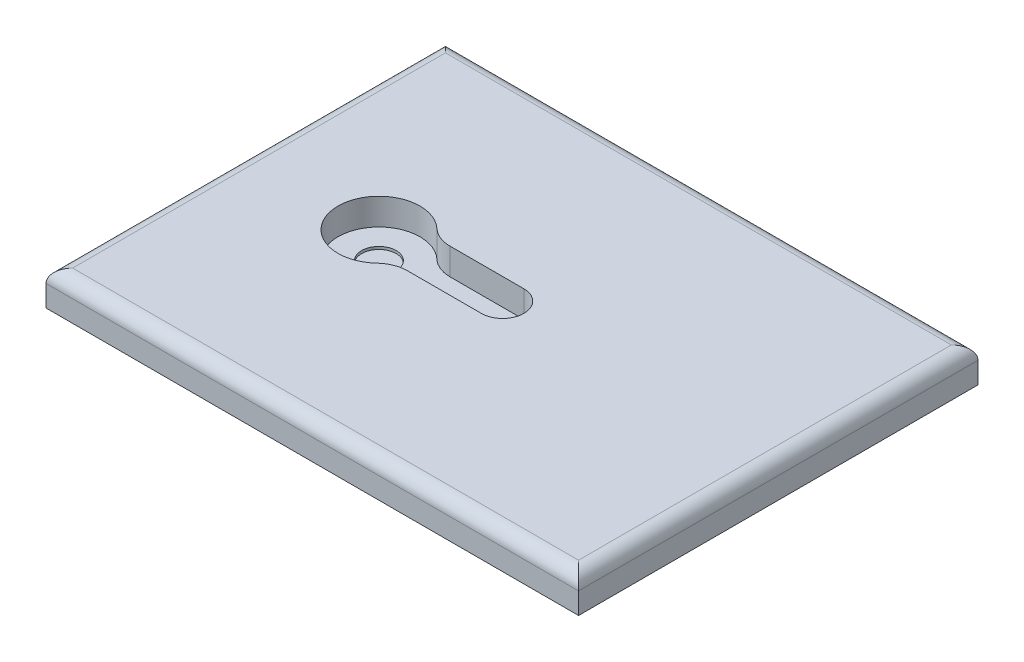
ISO-10303-21;
HEADER;
FILE_DESCRIPTION(('STEP AP214'),'2;1');
FILE_NAME('part.step','',(''),(''),'','','');
FILE_SCHEMA(('AUTOMOTIVE_DESIGN { 1 0 10303 214 1 1 1 1 }'));
ENDSEC;
DATA;
#1=APPLICATION_CONTEXT('core data for automotive mechanical design processes');
#2=APPLICATION_PROTOCOL_DEFINITION('international standard','automotive_design',2000,#1);
#3=PRODUCT_CONTEXT('',#1,'mechanical');
#4=PRODUCT('Part','Part','',(#3));
#5=PRODUCT_RELATED_PRODUCT_CATEGORY('part','',(#4));
#6=PRODUCT_DEFINITION_FORMATION('','',#4);
#7=PRODUCT_DEFINITION_CONTEXT('part definition',#1,'design');
#8=PRODUCT_DEFINITION('design','',#6,#7);
#9=PRODUCT_DEFINITION_SHAPE('','',#8);
#10=(LENGTH_UNIT() NAMED_UNIT(*) SI_UNIT(.MILLI.,.METRE.));
#11=(NAMED_UNIT(*) PLANE_ANGLE_UNIT() SI_UNIT($,.RADIAN.));
#12=(NAMED_UNIT(*) SI_UNIT($,.STERADIAN.) SOLID_ANGLE_UNIT());
#13=UNCERTAINTY_MEASURE_WITH_UNIT(LENGTH_MEASURE(1.E-05),#10,'distance_accuracy_value','');
#14=(GEOMETRIC_REPRESENTATION_CONTEXT(3) GLOBAL_UNCERTAINTY_ASSIGNED_CONTEXT((#13)) GLOBAL_UNIT_ASSIGNED_CONTEXT((#10,
#11,#12)) REPRESENTATION_CONTEXT('',''));
#15=CARTESIAN_POINT('',(0.,0.,0.));
#16=DIRECTION('',(0.,0.,1.));
#17=DIRECTION('',(1.,0.,0.));
#18=AXIS2_PLACEMENT_3D('',#15,#16,#17);
#19=CARTESIAN_POINT('',(-35.0274223034735,6.5,51.0146252285192));
#20=DIRECTION('',(1.,0.,0.));
#21=DIRECTION('',(0.,0.,-1.));
#22=AXIS2_PLACEMENT_3D('',#19,#20,#21);
#23=PLANE('',#22);
#24=DIRECTION('',(0.,-1.,0.));
#25=VECTOR('',#24,1.);
#26=CARTESIAN_POINT('',(-35.0274223034735,6.5,51.0146252285192));
#27=LINE('',#26,#25);
#28=CARTESIAN_POINT('',(-35.0274223034735,4.,51.0146252285192));
#29=VERTEX_POINT('',#28);
#30=CARTESIAN_POINT('',(-35.0274223034735,0.,51.0146252285192));
#31=VERTEX_POINT('',#30);
#32=EDGE_CURVE('E189',#29,#31,#27,.T.);
#33=ORIENTED_EDGE('',*,*,#32,.F.);
#34=DIRECTION('',(0.,0.,1.));
#35=VECTOR('',#34,1.);
#36=CARTESIAN_POINT('',(-35.0274223034735,4.,51.0146252285192));
#37=LINE('',#36,#35);
#38=CARTESIAN_POINT('',(-35.0274223034735,4.,-23.9853747714808));
#39=VERTEX_POINT('',#38);
#40=EDGE_CURVE('E200',#29,#39,#37,.F.);
#41=ORIENTED_EDGE('',*,*,#40,.T.);
#42=DIRECTION('',(0.,-1.,0.));
#43=VECTOR('',#42,1.);
#44=CARTESIAN_POINT('',(-35.0274223034735,6.5,-23.9853747714808));
#45=LINE('',#44,#43);
#46=CARTESIAN_POINT('',(-35.0274223034735,0.,-23.9853747714808));
#47=VERTEX_POINT('',#46);
#48=EDGE_CURVE('E183',#39,#47,#45,.T.);
#49=ORIENTED_EDGE('',*,*,#48,.T.);
#50=DIRECTION('',(0.,0.,1.));
#51=VECTOR('',#50,1.);
#52=CARTESIAN_POINT('',(-35.0274223034735,0.,51.0146252285192));
#53=LINE('',#52,#51);
#54=EDGE_CURVE('E170',#47,#31,#53,.T.);
#55=ORIENTED_EDGE('',*,*,#54,.T.);
#56=EDGE_LOOP('',(#33,#41,#49,#55));
#57=FACE_BOUND('',#56,.T.);
#58=ADVANCED_FACE('F41',(#57),#23,.F.);
#59=CARTESIAN_POINT('',(64.9725776965265,6.5,51.0146252285192));
#60=DIRECTION('',(0.,0.,-1.));
#61=DIRECTION('',(-1.,0.,0.));
#62=AXIS2_PLACEMENT_3D('',#59,#60,#61);
#63=PLANE('',#62);
#64=DIRECTION('',(0.,-1.,0.));
#65=VECTOR('',#64,1.);
#66=CARTESIAN_POINT('',(64.9725776965265,6.5,51.0146252285192));
#67=LINE('',#66,#65);
#68=CARTESIAN_POINT('',(64.9725776965265,4.,51.0146252285192));
#69=VERTEX_POINT('',#68);
#70=CARTESIAN_POINT('',(64.9725776965265,0.,51.0146252285192));
#71=VERTEX_POINT('',#70);
#72=EDGE_CURVE('E187',#69,#71,#67,.T.);
#73=ORIENTED_EDGE('',*,*,#72,.F.);
#74=DIRECTION('',(1.,0.,0.));
#75=VECTOR('',#74,1.);
#76=CARTESIAN_POINT('',(64.9725776965265,4.,51.0146252285192));
#77=LINE('',#76,#75);
#78=EDGE_CURVE('E207',#69,#29,#77,.F.);
#79=ORIENTED_EDGE('',*,*,#78,.T.);
#80=ORIENTED_EDGE('',*,*,#32,.T.);
#81=DIRECTION('',(1.,0.,0.));
#82=VECTOR('',#81,1.);
#83=CARTESIAN_POINT('',(64.9725776965265,0.,51.0146252285192));
#84=LINE('',#83,#82);
#85=EDGE_CURVE('E173',#31,#71,#84,.T.);
#86=ORIENTED_EDGE('',*,*,#85,.T.);
#87=EDGE_LOOP('',(#73,#79,#80,#86));
#88=FACE_BOUND('',#87,.T.);
#89=ADVANCED_FACE('F249',(#88),#63,.F.);
#90=CARTESIAN_POINT('',(64.9725776965265,6.5,-23.9853747714808));
#91=DIRECTION('',(-1.,0.,0.));
#92=DIRECTION('',(0.,0.,1.));
#93=AXIS2_PLACEMENT_3D('',#90,#91,#92);
#94=PLANE('',#93);
#95=DIRECTION('',(0.,-1.,0.));
#96=VECTOR('',#95,1.);
#97=CARTESIAN_POINT('',(64.9725776965265,6.5,-23.9853747714808));
#98=LINE('',#97,#96);
#99=CARTESIAN_POINT('',(64.9725776965265,4.,-23.9853747714808));
#100=VERTEX_POINT('',#99);
#101=CARTESIAN_POINT('',(64.9725776965265,0.,-23.9853747714808));
#102=VERTEX_POINT('',#101);
#103=EDGE_CURVE('E185',#100,#102,#98,.T.);
#104=ORIENTED_EDGE('',*,*,#103,.F.);
#105=DIRECTION('',(0.,0.,-1.));
#106=VECTOR('',#105,1.);
#107=CARTESIAN_POINT('',(64.9725776965265,4.,-23.9853747714808));
#108=LINE('',#107,#106);
#109=EDGE_CURVE('E205',#100,#69,#108,.F.);
#110=ORIENTED_EDGE('',*,*,#109,.T.);
#111=ORIENTED_EDGE('',*,*,#72,.T.);
#112=DIRECTION('',(0.,0.,-1.));
#113=VECTOR('',#112,1.);
#114=CARTESIAN_POINT('',(64.9725776965265,0.,-23.9853747714808));
#115=LINE('',#114,#113);
#116=EDGE_CURVE('E177',#71,#102,#115,.T.);
#117=ORIENTED_EDGE('',*,*,#116,.T.);
#118=EDGE_LOOP('',(#104,#110,#111,#117));
#119=FACE_BOUND('',#118,.T.);
#120=ADVANCED_FACE('F256',(#119),#94,.F.);
#121=CARTESIAN_POINT('',(-35.0274223034735,6.5,-23.9853747714808));
#122=DIRECTION('',(0.,0.,1.));
#123=DIRECTION('',(1.,0.,0.));
#124=AXIS2_PLACEMENT_3D('',#121,#122,#123);
#125=PLANE('',#124);
#126=ORIENTED_EDGE('',*,*,#48,.F.);
#127=DIRECTION('',(-1.,0.,0.));
#128=VECTOR('',#127,1.);
#129=CARTESIAN_POINT('',(-35.0274223034735,4.,-23.9853747714808));
#130=LINE('',#129,#128);
#131=EDGE_CURVE('E203',#39,#100,#130,.F.);
#132=ORIENTED_EDGE('',*,*,#131,.T.);
#133=ORIENTED_EDGE('',*,*,#103,.T.);
#134=DIRECTION('',(-1.,0.,0.));
#135=VECTOR('',#134,1.);
#136=CARTESIAN_POINT('',(-35.0274223034735,0.,-23.9853747714808));
#137=LINE('',#136,#135);
#138=EDGE_CURVE('E180',#102,#47,#137,.T.);
#139=ORIENTED_EDGE('',*,*,#138,.T.);
#140=EDGE_LOOP('',(#126,#132,#133,#139));
#141=FACE_BOUND('',#140,.T.);
#142=ADVANCED_FACE('F300',(#141),#125,.F.);
#143=CARTESIAN_POINT('',(0.,6.5,0.));
#144=DIRECTION('',(0.,-1.,0.));
#145=DIRECTION('',(0.,0.,-1.));
#146=AXIS2_PLACEMENT_3D('',#143,#144,#145);
#147=PLANE('',#146);
#148=DIRECTION('',(1.,0.,0.));
#149=VECTOR('',#148,1.);
#150=CARTESIAN_POINT('',(-3.42616702003037,6.5,17.5146252285192));
#151=LINE('',#150,#149);
#152=CARTESIAN_POINT('',(-0.641386792981187,6.5,17.5146252285192));
#153=VERTEX_POINT('',#152);
#154=CARTESIAN_POINT('',(13.2130715419053,6.5,17.5146252285192));
#155=VERTEX_POINT('',#154);
#156=EDGE_CURVE('E148',#153,#155,#151,.T.);
#157=ORIENTED_EDGE('',*,*,#156,.F.);
#158=CARTESIAN_POINT('',(-0.641386792981187,6.5,23.5146252285192));
#159=DIRECTION('',(0.,-1.,0.));
#160=DIRECTION('',(0.,0.,-1.));
#161=AXIS2_PLACEMENT_3D('',#158,#159,#160);
#162=CIRCLE('',#161,6.);
#163=CARTESIAN_POINT('',(-4.74253740037721,6.5,19.1350631847236));
#164=VERTEX_POINT('',#163);
#165=EDGE_CURVE('E221',#153,#164,#162,.F.);
#166=ORIENTED_EDGE('',*,*,#165,.T.);
#167=CARTESIAN_POINT('',(-10.0056806798688,6.5,13.5146252285192));
#168=DIRECTION('',(0.,1.,0.));
#169=DIRECTION('',(0.,0.,1.));
#170=AXIS2_PLACEMENT_3D('',#167,#168,#169);
#171=CIRCLE('',#170,7.7);
#172=CARTESIAN_POINT('',(-4.74253740037721,6.5,7.8941872723148));
#173=VERTEX_POINT('',#172);
#174=EDGE_CURVE('E160',#173,#164,#171,.T.);
#175=ORIENTED_EDGE('',*,*,#174,.F.);
#176=CARTESIAN_POINT('',(-0.641386792981188,6.5,3.51462522851917));
#177=DIRECTION('',(0.,-1.,0.));
#178=DIRECTION('',(0.,0.,-1.));
#179=AXIS2_PLACEMENT_3D('',#176,#177,#178);
#180=CIRCLE('',#179,6.);
#181=CARTESIAN_POINT('',(-0.641386792981188,6.5,9.51462522851917));
#182=VERTEX_POINT('',#181);
#183=EDGE_CURVE('E219',#173,#182,#180,.F.);
#184=ORIENTED_EDGE('',*,*,#183,.T.);
#185=DIRECTION('',(-1.,0.,0.));
#186=VECTOR('',#185,1.);
#187=CARTESIAN_POINT('',(-3.42616702003037,6.5,9.51462522851917));
#188=LINE('',#187,#186);
#189=CARTESIAN_POINT('',(13.2130715419053,6.5,9.51462522851917));
#190=VERTEX_POINT('',#189);
#191=EDGE_CURVE('E166',#190,#182,#188,.T.);
#192=ORIENTED_EDGE('',*,*,#191,.F.);
#193=CARTESIAN_POINT('',(13.2130715419053,6.5,13.5146252285192));
#194=DIRECTION('',(0.,1.,0.));
#195=DIRECTION('',(0.,0.,-1.));
#196=AXIS2_PLACEMENT_3D('',#193,#194,#195);
#197=CIRCLE('',#196,4.);
#198=EDGE_CURVE('E164',#155,#190,#197,.T.);
#199=ORIENTED_EDGE('',*,*,#198,.F.);
#200=EDGE_LOOP('',(#157,#166,#175,#184,#192,#199));
#201=FACE_BOUND('',#200,.T.);
#202=DIRECTION('',(-1.,0.,0.));
#203=VECTOR('',#202,1.);
#204=CARTESIAN_POINT('',(0.,6.5,-21.4853747714808));
#205=LINE('',#204,#203);
#206=CARTESIAN_POINT('',(62.4725776965265,6.5,-21.4853747714808));
#207=VERTEX_POINT('',#206);
#208=CARTESIAN_POINT('',(-32.5274223034735,6.5,-21.4853747714808));
#209=VERTEX_POINT('',#208);
#210=EDGE_CURVE('E195',#207,#209,#205,.T.);
#211=ORIENTED_EDGE('',*,*,#210,.T.);
#212=DIRECTION('',(0.,0.,1.));
#213=VECTOR('',#212,1.);
#214=CARTESIAN_POINT('',(-32.5274223034735,6.5,0.));
#215=LINE('',#214,#213);
#216=CARTESIAN_POINT('',(-32.5274223034735,6.5,48.5146252285192));
#217=VERTEX_POINT('',#216);
#218=EDGE_CURVE('E197',#209,#217,#215,.T.);
#219=ORIENTED_EDGE('',*,*,#218,.T.);
#220=DIRECTION('',(1.,0.,0.));
#221=VECTOR('',#220,1.);
#222=CARTESIAN_POINT('',(0.,6.5,48.5146252285192));
#223=LINE('',#222,#221);
#224=CARTESIAN_POINT('',(62.4725776965265,6.5,48.5146252285192));
#225=VERTEX_POINT('',#224);
#226=EDGE_CURVE('E191',#217,#225,#223,.T.);
#227=ORIENTED_EDGE('',*,*,#226,.T.);
#228=DIRECTION('',(0.,0.,-1.));
#229=VECTOR('',#228,1.);
#230=CARTESIAN_POINT('',(62.4725776965265,6.5,0.));
#231=LINE('',#230,#229);
#232=EDGE_CURVE('E193',#225,#207,#231,.T.);
#233=ORIENTED_EDGE('',*,*,#232,.T.);
#234=EDGE_LOOP('',(#211,#219,#227,#233));
#235=FACE_BOUND('',#234,.T.);
#236=ADVANCED_FACE('F233',(#201,#235),#147,.F.);
#237=CARTESIAN_POINT('',(0.,0.,0.));
#238=DIRECTION('',(0.,-1.,0.));
#239=DIRECTION('',(0.,0.,-1.));
#240=AXIS2_PLACEMENT_3D('',#237,#238,#239);
#241=PLANE('',#240);
#242=ORIENTED_EDGE('',*,*,#54,.F.);
#243=ORIENTED_EDGE('',*,*,#138,.F.);
#244=ORIENTED_EDGE('',*,*,#116,.F.);
#245=ORIENTED_EDGE('',*,*,#85,.F.);
#246=EDGE_LOOP('',(#242,#243,#244,#245));
#247=FACE_BOUND('',#246,.T.);
#248=ADVANCED_FACE('F275',(#247),#241,.T.);
#249=CARTESIAN_POINT('',(62.4725776965265,4.,0.));
#250=DIRECTION('',(0.,0.,-1.));
#251=DIRECTION('',(-1.,0.,0.));
#252=AXIS2_PLACEMENT_3D('',#249,#250,#251);
#253=CYLINDRICAL_SURFACE('',#252,2.5);
#254=CARTESIAN_POINT('',(62.4725776965265,4.,48.5146252285192));
#255=DIRECTION('',(0.707106781186547,0.,-0.707106781186548));
#256=DIRECTION('',(0.707106781186548,0.,0.707106781186547));
#257=AXIS2_PLACEMENT_3D('',#254,#255,#256);
#258=ELLIPSE('',#257,3.53553390593274,2.5);
#259=EDGE_CURVE('E213',#69,#225,#258,.F.);
#260=ORIENTED_EDGE('',*,*,#259,.F.);
#261=ORIENTED_EDGE('',*,*,#109,.F.);
#262=CARTESIAN_POINT('',(62.4725776965265,4.,-21.4853747714808));
#263=DIRECTION('',(-0.707106781186548,0.,-0.707106781186547));
#264=DIRECTION('',(0.707106781186547,0.,-0.707106781186548));
#265=AXIS2_PLACEMENT_3D('',#262,#263,#264);
#266=ELLIPSE('',#265,3.53553390593274,2.5);
#267=EDGE_CURVE('E174',#207,#100,#266,.T.);
#268=ORIENTED_EDGE('',*,*,#267,.F.);
#269=ORIENTED_EDGE('',*,*,#232,.F.);
#270=EDGE_LOOP('',(#260,#261,#268,#269));
#271=FACE_BOUND('',#270,.T.);
#272=ADVANCED_FACE('F272',(#271),#253,.T.);
#273=CARTESIAN_POINT('',(0.,4.,-21.4853747714808));
#274=DIRECTION('',(-1.,0.,0.));
#275=DIRECTION('',(0.,0.,1.));
#276=AXIS2_PLACEMENT_3D('',#273,#274,#275);
#277=CYLINDRICAL_SURFACE('',#276,2.5);
#278=ORIENTED_EDGE('',*,*,#267,.T.);
#279=ORIENTED_EDGE('',*,*,#131,.F.);
#280=CARTESIAN_POINT('',(-32.5274223034735,4.,-21.4853747714808));
#281=DIRECTION('',(-0.707106781186547,0.,0.707106781186547));
#282=DIRECTION('',(-0.707106781186547,0.,-0.707106781186547));
#283=AXIS2_PLACEMENT_3D('',#280,#281,#282);
#284=ELLIPSE('',#283,3.53553390593274,2.5);
#285=EDGE_CURVE('E211',#209,#39,#284,.T.);
#286=ORIENTED_EDGE('',*,*,#285,.F.);
#287=ORIENTED_EDGE('',*,*,#210,.F.);
#288=EDGE_LOOP('',(#278,#279,#286,#287));
#289=FACE_BOUND('',#288,.T.);
#290=ADVANCED_FACE('F269',(#289),#277,.T.);
#291=CARTESIAN_POINT('',(0.,4.,48.5146252285192));
#292=DIRECTION('',(1.,0.,0.));
#293=DIRECTION('',(0.,0.,-1.));
#294=AXIS2_PLACEMENT_3D('',#291,#292,#293);
#295=CYLINDRICAL_SURFACE('',#294,2.5);
#296=ORIENTED_EDGE('',*,*,#259,.T.);
#297=ORIENTED_EDGE('',*,*,#226,.F.);
#298=CARTESIAN_POINT('',(-32.5274223034735,4.,48.5146252285192));
#299=DIRECTION('',(0.707106781186548,0.,0.707106781186547));
#300=DIRECTION('',(0.707106781186547,0.,-0.707106781186547));
#301=AXIS2_PLACEMENT_3D('',#298,#299,#300);
#302=ELLIPSE('',#301,3.53553390593274,2.5);
#303=EDGE_CURVE('E168',#29,#217,#302,.F.);
#304=ORIENTED_EDGE('',*,*,#303,.F.);
#305=ORIENTED_EDGE('',*,*,#78,.F.);
#306=EDGE_LOOP('',(#296,#297,#304,#305));
#307=FACE_BOUND('',#306,.T.);
#308=ADVANCED_FACE('F265',(#307),#295,.T.);
#309=CARTESIAN_POINT('',(-32.5274223034735,4.,0.));
#310=DIRECTION('',(0.,0.,1.));
#311=DIRECTION('',(1.,0.,0.));
#312=AXIS2_PLACEMENT_3D('',#309,#310,#311);
#313=CYLINDRICAL_SURFACE('',#312,2.5);
#314=ORIENTED_EDGE('',*,*,#285,.T.);
#315=ORIENTED_EDGE('',*,*,#40,.F.);
#316=ORIENTED_EDGE('',*,*,#303,.T.);
#317=ORIENTED_EDGE('',*,*,#218,.F.);
#318=EDGE_LOOP('',(#314,#315,#316,#317));
#319=FACE_BOUND('',#318,.T.);
#320=ADVANCED_FACE('F262',(#319),#313,.T.);
#321=CARTESIAN_POINT('',(-10.0056806798688,1.5,13.5146252285192));
#322=DIRECTION('',(0.,1.,0.));
#323=DIRECTION('',(0.,0.,1.));
#324=AXIS2_PLACEMENT_3D('',#321,#322,#323);
#325=CYLINDRICAL_SURFACE('',#324,7.7);
#326=ORIENTED_EDGE('',*,*,#174,.T.);
#327=DIRECTION('',(0.,1.,0.));
#328=VECTOR('',#327,1.);
#329=CARTESIAN_POINT('',(-4.74253740037721,1.5,19.1350631847236));
#330=LINE('',#329,#328);
#331=CARTESIAN_POINT('',(-4.74253740037721,1.5,19.1350631847236));
#332=VERTEX_POINT('',#331);
#333=EDGE_CURVE('E64',#164,#332,#330,.F.);
#334=ORIENTED_EDGE('',*,*,#333,.T.);
#335=CARTESIAN_POINT('',(-10.0056806798688,1.5,13.5146252285192));
#336=DIRECTION('',(0.,1.,0.));
#337=DIRECTION('',(0.,0.,1.));
#338=AXIS2_PLACEMENT_3D('',#335,#336,#337);
#339=CIRCLE('',#338,7.7);
#340=CARTESIAN_POINT('',(-4.74253740037721,1.5,7.8941872723148));
#341=VERTEX_POINT('',#340);
#342=EDGE_CURVE('E142',#341,#332,#339,.T.);
#343=ORIENTED_EDGE('',*,*,#342,.F.);
#344=DIRECTION('',(0.,1.,0.));
#345=VECTOR('',#344,1.);
#346=CARTESIAN_POINT('',(-4.74253740037721,1.5,7.8941872723148));
#347=LINE('',#346,#345);
#348=EDGE_CURVE('E223',#341,#173,#347,.T.);
#349=ORIENTED_EDGE('',*,*,#348,.T.);
#350=EDGE_LOOP('',(#326,#334,#343,#349));
#351=FACE_BOUND('',#350,.T.);
#352=ADVANCED_FACE('F229',(#351),#325,.F.);
#353=CARTESIAN_POINT('',(-3.42616702003037,1.5,9.51462522851917));
#354=DIRECTION('',(0.,0.,-1.));
#355=DIRECTION('',(-1.,0.,0.));
#356=AXIS2_PLACEMENT_3D('',#353,#354,#355);
#357=PLANE('',#356);
#358=ORIENTED_EDGE('',*,*,#191,.T.);
#359=DIRECTION('',(0.,1.,0.));
#360=VECTOR('',#359,1.);
#361=CARTESIAN_POINT('',(-0.641386792981188,1.5,9.51462522851917));
#362=LINE('',#361,#360);
#363=CARTESIAN_POINT('',(-0.641386792981188,1.5,9.51462522851917));
#364=VERTEX_POINT('',#363);
#365=EDGE_CURVE('E56',#182,#364,#362,.F.);
#366=ORIENTED_EDGE('',*,*,#365,.T.);
#367=DIRECTION('',(-1.,0.,0.));
#368=VECTOR('',#367,1.);
#369=CARTESIAN_POINT('',(-3.42616702003037,1.5,9.51462522851917));
#370=LINE('',#369,#368);
#371=CARTESIAN_POINT('',(13.2130715419053,1.5,9.51462522851917));
#372=VERTEX_POINT('',#371);
#373=EDGE_CURVE('E153',#372,#364,#370,.T.);
#374=ORIENTED_EDGE('',*,*,#373,.F.);
#375=DIRECTION('',(0.,1.,0.));
#376=VECTOR('',#375,1.);
#377=CARTESIAN_POINT('',(13.2130715419053,1.5,9.51462522851917));
#378=LINE('',#377,#376);
#379=EDGE_CURVE('E152',#372,#190,#378,.T.);
#380=ORIENTED_EDGE('',*,*,#379,.T.);
#381=EDGE_LOOP('',(#358,#366,#374,#380));
#382=FACE_BOUND('',#381,.T.);
#383=ADVANCED_FACE('F313',(#382),#357,.F.);
#384=CARTESIAN_POINT('',(13.2130715419053,1.5,13.5146252285192));
#385=DIRECTION('',(0.,1.,0.));
#386=DIRECTION('',(0.,0.,1.));
#387=AXIS2_PLACEMENT_3D('',#384,#385,#386);
#388=CYLINDRICAL_SURFACE('',#387,4.);
#389=ORIENTED_EDGE('',*,*,#198,.T.);
#390=ORIENTED_EDGE('',*,*,#379,.F.);
#391=CARTESIAN_POINT('',(13.2130715419053,1.5,13.5146252285192));
#392=DIRECTION('',(0.,1.,0.));
#393=DIRECTION('',(0.,0.,-1.));
#394=AXIS2_PLACEMENT_3D('',#391,#392,#393);
#395=CIRCLE('',#394,4.);
#396=CARTESIAN_POINT('',(13.2130715419053,1.5,17.5146252285192));
#397=VERTEX_POINT('',#396);
#398=EDGE_CURVE('E137',#397,#372,#395,.T.);
#399=ORIENTED_EDGE('',*,*,#398,.F.);
#400=DIRECTION('',(0.,1.,0.));
#401=VECTOR('',#400,1.);
#402=CARTESIAN_POINT('',(13.2130715419053,1.5,17.5146252285192));
#403=LINE('',#402,#401);
#404=EDGE_CURVE('E145',#397,#155,#403,.T.);
#405=ORIENTED_EDGE('',*,*,#404,.T.);
#406=EDGE_LOOP('',(#389,#390,#399,#405));
#407=FACE_BOUND('',#406,.T.);
#408=ADVANCED_FACE('F155',(#407),#388,.F.);
#409=CARTESIAN_POINT('',(-3.42616702003037,1.5,17.5146252285192));
#410=DIRECTION('',(0.,0.,1.));
#411=DIRECTION('',(1.,0.,0.));
#412=AXIS2_PLACEMENT_3D('',#409,#410,#411);
#413=PLANE('',#412);
#414=DIRECTION('',(1.,0.,0.));
#415=VECTOR('',#414,1.);
#416=CARTESIAN_POINT('',(-3.42616702003037,1.5,17.5146252285192));
#417=LINE('',#416,#415);
#418=CARTESIAN_POINT('',(-0.641386792981187,1.5,17.5146252285192));
#419=VERTEX_POINT('',#418);
#420=EDGE_CURVE('E133',#419,#397,#417,.T.);
#421=ORIENTED_EDGE('',*,*,#420,.F.);
#422=DIRECTION('',(0.,1.,0.));
#423=VECTOR('',#422,1.);
#424=CARTESIAN_POINT('',(-0.641386792981187,1.5,17.5146252285192));
#425=LINE('',#424,#423);
#426=EDGE_CURVE('E209',#419,#153,#425,.T.);
#427=ORIENTED_EDGE('',*,*,#426,.T.);
#428=ORIENTED_EDGE('',*,*,#156,.T.);
#429=ORIENTED_EDGE('',*,*,#404,.F.);
#430=EDGE_LOOP('',(#421,#427,#428,#429));
#431=FACE_BOUND('',#430,.T.);
#432=ADVANCED_FACE('F146',(#431),#413,.F.);
#433=CARTESIAN_POINT('',(-10.0056806798688,1.5,13.5146252285192));
#434=DIRECTION('',(0.,1.,0.));
#435=DIRECTION('',(0.,0.,1.));
#436=AXIS2_PLACEMENT_3D('',#433,#434,#435);
#437=PLANE('',#436);
#438=CARTESIAN_POINT('',(-9.99208690221499,1.5,13.5327069589596));
#439=DIRECTION('',(0.,1.,0.));
#440=DIRECTION('',(0.,0.,1.));
#441=AXIS2_PLACEMENT_3D('',#438,#439,#440);
#442=CIRCLE('',#441,3.25);
#443=CARTESIAN_POINT('',(-9.99208690221499,1.5,16.7827069589596));
#444=VERTEX_POINT('',#443);
#445=EDGE_CURVE('E329',#444,#444,#442,.T.);
#446=ORIENTED_EDGE('',*,*,#445,.F.);
#447=EDGE_LOOP('',(#446));
#448=FACE_BOUND('',#447,.T.);
#449=ORIENTED_EDGE('',*,*,#373,.T.);
#450=CARTESIAN_POINT('',(-0.641386792981188,1.5,3.51462522851917));
#451=DIRECTION('',(0.,1.,0.));
#452=DIRECTION('',(0.,0.,1.));
#453=AXIS2_PLACEMENT_3D('',#450,#451,#452);
#454=CIRCLE('',#453,6.);
#455=EDGE_CURVE('E11',#364,#341,#454,.F.);
#456=ORIENTED_EDGE('',*,*,#455,.T.);
#457=ORIENTED_EDGE('',*,*,#342,.T.);
#458=CARTESIAN_POINT('',(-0.641386792981187,1.5,23.5146252285192));
#459=DIRECTION('',(0.,1.,0.));
#460=DIRECTION('',(0.,0.,1.));
#461=AXIS2_PLACEMENT_3D('',#458,#459,#460);
#462=CIRCLE('',#461,6.);
#463=EDGE_CURVE('E49',#332,#419,#462,.F.);
#464=ORIENTED_EDGE('',*,*,#463,.T.);
#465=ORIENTED_EDGE('',*,*,#420,.T.);
#466=ORIENTED_EDGE('',*,*,#398,.T.);
#467=EDGE_LOOP('',(#449,#456,#457,#464,#465,#466));
#468=FACE_BOUND('',#467,.T.);
#469=ADVANCED_FACE('F135',(#448,#468),#437,.T.);
#470=CARTESIAN_POINT('',(-0.641386792981187,1.5,23.5146252285192));
#471=DIRECTION('',(0.,1.,0.));
#472=DIRECTION('',(0.,0.,1.));
#473=AXIS2_PLACEMENT_3D('',#470,#471,#472);
#474=CYLINDRICAL_SURFACE('',#473,6.);
#475=ORIENTED_EDGE('',*,*,#463,.F.);
#476=ORIENTED_EDGE('',*,*,#333,.F.);
#477=ORIENTED_EDGE('',*,*,#165,.F.);
#478=ORIENTED_EDGE('',*,*,#426,.F.);
#479=EDGE_LOOP('',(#475,#476,#477,#478));
#480=FACE_BOUND('',#479,.T.);
#481=ADVANCED_FACE('F237',(#480),#474,.T.);
#482=CARTESIAN_POINT('',(-0.641386792981188,1.5,3.51462522851917));
#483=DIRECTION('',(0.,1.,0.));
#484=DIRECTION('',(0.,0.,1.));
#485=AXIS2_PLACEMENT_3D('',#482,#483,#484);
#486=CYLINDRICAL_SURFACE('',#485,6.);
#487=ORIENTED_EDGE('',*,*,#455,.F.);
#488=ORIENTED_EDGE('',*,*,#365,.F.);
#489=ORIENTED_EDGE('',*,*,#183,.F.);
#490=ORIENTED_EDGE('',*,*,#348,.F.);
#491=EDGE_LOOP('',(#487,#488,#489,#490));
#492=FACE_BOUND('',#491,.T.);
#493=ADVANCED_FACE('F43',(#492),#486,.T.);
#494=CARTESIAN_POINT('',(-9.99208690221499,1.,13.5327069589596));
#495=DIRECTION('',(0.,1.,0.));
#496=DIRECTION('',(0.,0.,1.));
#497=AXIS2_PLACEMENT_3D('',#494,#495,#496);
#498=CYLINDRICAL_SURFACE('',#497,3.25);
#499=CARTESIAN_POINT('',(-9.99208690221499,1.,13.5327069589596));
#500=DIRECTION('',(0.,1.,0.));
#501=DIRECTION('',(0.,0.,1.));
#502=AXIS2_PLACEMENT_3D('',#499,#500,#501);
#503=CIRCLE('',#502,3.25);
#504=CARTESIAN_POINT('',(-9.99208690221499,1.,16.7827069589596));
#505=VERTEX_POINT('',#504);
#506=EDGE_CURVE('E162',#505,#505,#503,.T.);
#507=ORIENTED_EDGE('',*,*,#506,.F.);
#508=EDGE_LOOP('',(#507));
#509=FACE_BOUND('',#508,.T.);
#510=ORIENTED_EDGE('',*,*,#445,.T.);
#511=EDGE_LOOP('',(#510));
#512=FACE_BOUND('',#511,.T.);
#513=ADVANCED_FACE('F243',(#509,#512),#498,.F.);
#514=CARTESIAN_POINT('',(-9.99208690221499,1.,13.5327069589596));
#515=DIRECTION('',(0.,1.,0.));
#516=DIRECTION('',(0.,0.,1.));
#517=AXIS2_PLACEMENT_3D('',#514,#515,#516);
#518=PLANE('',#517);
#519=ORIENTED_EDGE('',*,*,#506,.T.);
#520=EDGE_LOOP('',(#519));
#521=FACE_BOUND('',#520,.T.);
#522=ADVANCED_FACE('F321',(#521),#518,.T.);
#523=CLOSED_SHELL('',(#58,#89,#120,#142,#236,#248,#272,#290,#308,#320,#352,#383,#408,#432,#469,
#481,#493,#513,#522));
#524=MANIFOLD_SOLID_BREP('B2',#523);
#525=ADVANCED_BREP_SHAPE_REPRESENTATION('',(#18,#524),#14);
#526=SHAPE_DEFINITION_REPRESENTATION(#9,#525);
ENDSEC;
END-ISO-10303-21;
